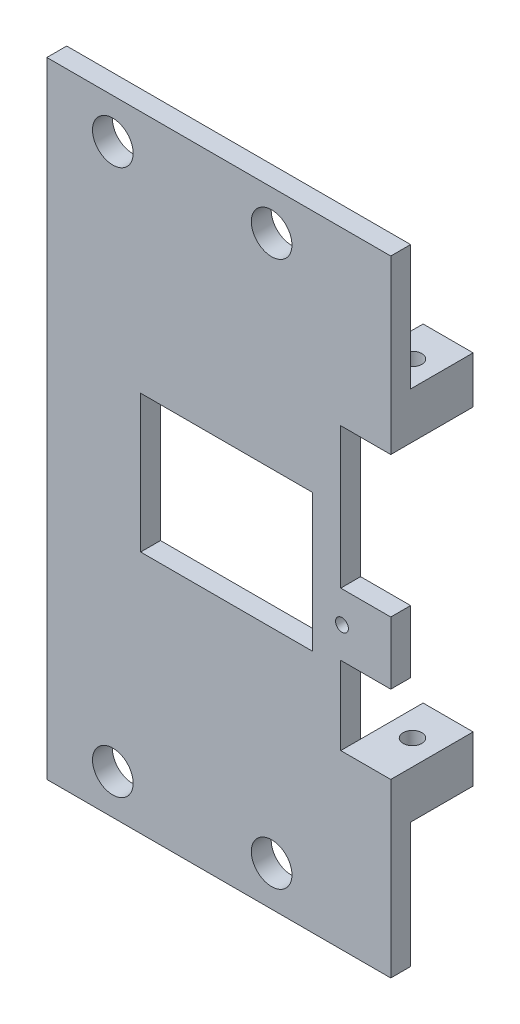
ISO-10303-21;
HEADER;
FILE_DESCRIPTION(('STEP AP214'),'2;1');
FILE_NAME('part.step','',(''),(''),'','','');
FILE_SCHEMA(('AUTOMOTIVE_DESIGN { 1 0 10303 214 1 1 1 1 }'));
ENDSEC;
DATA;
#1=APPLICATION_CONTEXT('core data for automotive mechanical design processes');
#2=APPLICATION_PROTOCOL_DEFINITION('international standard','automotive_design',2000,#1);
#3=PRODUCT_CONTEXT('',#1,'mechanical');
#4=PRODUCT('Part','Part','',(#3));
#5=PRODUCT_RELATED_PRODUCT_CATEGORY('part','',(#4));
#6=PRODUCT_DEFINITION_FORMATION('','',#4);
#7=PRODUCT_DEFINITION_CONTEXT('part definition',#1,'design');
#8=PRODUCT_DEFINITION('design','',#6,#7);
#9=PRODUCT_DEFINITION_SHAPE('','',#8);
#10=(LENGTH_UNIT() NAMED_UNIT(*) SI_UNIT(.MILLI.,.METRE.));
#11=(NAMED_UNIT(*) PLANE_ANGLE_UNIT() SI_UNIT($,.RADIAN.));
#12=(NAMED_UNIT(*) SI_UNIT($,.STERADIAN.) SOLID_ANGLE_UNIT());
#13=UNCERTAINTY_MEASURE_WITH_UNIT(LENGTH_MEASURE(1.E-05),#10,'distance_accuracy_value','');
#14=(GEOMETRIC_REPRESENTATION_CONTEXT(3) GLOBAL_UNCERTAINTY_ASSIGNED_CONTEXT((#13)) GLOBAL_UNIT_ASSIGNED_CONTEXT((#10,
#11,#12)) REPRESENTATION_CONTEXT('',''));
#15=CARTESIAN_POINT('',(0.,0.,0.));
#16=DIRECTION('',(0.,0.,1.));
#17=DIRECTION('',(1.,0.,0.));
#18=AXIS2_PLACEMENT_3D('',#15,#16,#17);
#19=CARTESIAN_POINT('',(54.5,-60.,3.175));
#20=DIRECTION('',(-1.,0.,0.));
#21=DIRECTION('',(0.,0.,1.));
#22=AXIS2_PLACEMENT_3D('',#19,#20,#21);
#23=PLANE('',#22);
#24=DIRECTION('',(0.,0.,1.));
#25=VECTOR('',#24,1.);
#26=CARTESIAN_POINT('',(54.5,-37.5,0.));
#27=LINE('',#26,#25);
#28=CARTESIAN_POINT('',(54.5,-37.5,0.));
#29=VERTEX_POINT('',#28);
#30=CARTESIAN_POINT('',(54.5,-37.5,3.175));
#31=VERTEX_POINT('',#30);
#32=EDGE_CURVE('E56',#29,#31,#27,.T.);
#33=ORIENTED_EDGE('',*,*,#32,.F.);
#34=DIRECTION('',(0.,1.,0.));
#35=VECTOR('',#34,1.);
#36=CARTESIAN_POINT('',(54.5,-60.,0.));
#37=LINE('',#36,#35);
#38=CARTESIAN_POINT('',(54.5,-15.,0.));
#39=VERTEX_POINT('',#38);
#40=EDGE_CURVE('E228',#29,#39,#37,.T.);
#41=ORIENTED_EDGE('',*,*,#40,.T.);
#42=DIRECTION('',(0.,0.,-1.));
#43=VECTOR('',#42,1.);
#44=CARTESIAN_POINT('',(54.5,-15.,3.175));
#45=LINE('',#44,#43);
#46=CARTESIAN_POINT('',(54.5,-15.,3.175));
#47=VERTEX_POINT('',#46);
#48=EDGE_CURVE('E229',#47,#39,#45,.T.);
#49=ORIENTED_EDGE('',*,*,#48,.F.);
#50=DIRECTION('',(0.,1.,0.));
#51=VECTOR('',#50,1.);
#52=CARTESIAN_POINT('',(54.5,-60.,3.175));
#53=LINE('',#52,#51);
#54=EDGE_CURVE('E217',#31,#47,#53,.T.);
#55=ORIENTED_EDGE('',*,*,#54,.F.);
#56=EDGE_LOOP('',(#33,#41,#49,#55));
#57=FACE_BOUND('',#56,.T.);
#58=ADVANCED_FACE('F39',(#57),#23,.F.);
#59=DIRECTION('',(0.,0.,-1.));
#60=VECTOR('',#59,1.);
#61=CARTESIAN_POINT('',(54.5,-47.5,0.));
#62=LINE('',#61,#60);
#63=CARTESIAN_POINT('',(54.5,-47.5,3.175));
#64=VERTEX_POINT('',#63);
#65=CARTESIAN_POINT('',(54.5,-47.5,0.));
#66=VERTEX_POINT('',#65);
#67=EDGE_CURVE('E190',#64,#66,#62,.T.);
#68=ORIENTED_EDGE('',*,*,#67,.F.);
#69=CARTESIAN_POINT('',(54.5,-60.,3.175));
#70=VERTEX_POINT('',#69);
#71=EDGE_CURVE('E203',#70,#64,#53,.T.);
#72=ORIENTED_EDGE('',*,*,#71,.F.);
#73=DIRECTION('',(0.,0.,-1.));
#74=VECTOR('',#73,1.);
#75=CARTESIAN_POINT('',(54.5,-60.,3.175));
#76=LINE('',#75,#74);
#77=CARTESIAN_POINT('',(54.5,-60.,0.));
#78=VERTEX_POINT('',#77);
#79=EDGE_CURVE('E221',#70,#78,#76,.T.);
#80=ORIENTED_EDGE('',*,*,#79,.T.);
#81=EDGE_CURVE('E206',#78,#66,#37,.T.);
#82=ORIENTED_EDGE('',*,*,#81,.T.);
#83=EDGE_LOOP('',(#68,#72,#80,#82));
#84=FACE_BOUND('',#83,.T.);
#85=ADVANCED_FACE('F202',(#84),#23,.F.);
#86=CARTESIAN_POINT('',(62.5,12.5,3.175));
#87=DIRECTION('',(-1.,0.,0.));
#88=DIRECTION('',(0.,-1.,0.));
#89=AXIS2_PLACEMENT_3D('',#86,#87,#88);
#90=PLANE('',#89);
#91=DIRECTION('',(0.,1.,0.));
#92=VECTOR('',#91,1.);
#93=CARTESIAN_POINT('',(62.5,12.5,3.175));
#94=LINE('',#93,#92);
#95=CARTESIAN_POINT('',(62.5,-15.,3.175));
#96=VERTEX_POINT('',#95);
#97=CARTESIAN_POINT('',(62.5,12.5,3.175));
#98=VERTEX_POINT('',#97);
#99=EDGE_CURVE('E395',#96,#98,#94,.T.);
#100=ORIENTED_EDGE('',*,*,#99,.F.);
#101=DIRECTION('',(0.,0.,-1.));
#102=VECTOR('',#101,1.);
#103=CARTESIAN_POINT('',(62.5,-15.,0.));
#104=LINE('',#103,#102);
#105=CARTESIAN_POINT('',(62.5,-15.,-10.));
#106=VERTEX_POINT('',#105);
#107=EDGE_CURVE('E285',#96,#106,#104,.T.);
#108=ORIENTED_EDGE('',*,*,#107,.T.);
#109=DIRECTION('',(0.,-1.,0.));
#110=VECTOR('',#109,1.);
#111=CARTESIAN_POINT('',(62.5,-7.50000000000001,-10.));
#112=LINE('',#111,#110);
#113=CARTESIAN_POINT('',(62.5,-7.50000000000001,-10.));
#114=VERTEX_POINT('',#113);
#115=EDGE_CURVE('E299',#114,#106,#112,.T.);
#116=ORIENTED_EDGE('',*,*,#115,.F.);
#117=DIRECTION('',(0.,0.,1.));
#118=VECTOR('',#117,1.);
#119=CARTESIAN_POINT('',(62.5,-7.50000000000001,-10.));
#120=LINE('',#119,#118);
#121=CARTESIAN_POINT('',(62.5,-7.5,0.));
#122=VERTEX_POINT('',#121);
#123=EDGE_CURVE('E315',#114,#122,#120,.T.);
#124=ORIENTED_EDGE('',*,*,#123,.T.);
#125=DIRECTION('',(0.,1.,0.));
#126=VECTOR('',#125,1.);
#127=CARTESIAN_POINT('',(62.5,12.5,0.));
#128=LINE('',#127,#126);
#129=CARTESIAN_POINT('',(62.5,12.5,0.));
#130=VERTEX_POINT('',#129);
#131=EDGE_CURVE('E409',#122,#130,#128,.T.);
#132=ORIENTED_EDGE('',*,*,#131,.T.);
#133=DIRECTION('',(0.,0.,-1.));
#134=VECTOR('',#133,1.);
#135=CARTESIAN_POINT('',(62.5,12.5,3.175));
#136=LINE('',#135,#134);
#137=EDGE_CURVE('E419',#98,#130,#136,.T.);
#138=ORIENTED_EDGE('',*,*,#137,.F.);
#139=EDGE_LOOP('',(#100,#108,#116,#124,#132,#138));
#140=FACE_BOUND('',#139,.T.);
#141=ADVANCED_FACE('F481',(#140),#90,.F.);
#142=CARTESIAN_POINT('',(54.5,-7.5,-10.));
#143=DIRECTION('',(1.,0.,0.));
#144=DIRECTION('',(0.,1.,0.));
#145=AXIS2_PLACEMENT_3D('',#142,#143,#144);
#146=PLANE('',#145);
#147=DIRECTION('',(0.,1.,0.));
#148=VECTOR('',#147,1.);
#149=CARTESIAN_POINT('',(54.5,-7.5,-10.));
#150=LINE('',#149,#148);
#151=CARTESIAN_POINT('',(54.5,-15.,-10.));
#152=VERTEX_POINT('',#151);
#153=CARTESIAN_POINT('',(54.5,-7.5,-10.));
#154=VERTEX_POINT('',#153);
#155=EDGE_CURVE('E307',#152,#154,#150,.T.);
#156=ORIENTED_EDGE('',*,*,#155,.F.);
#157=DIRECTION('',(0.,0.,-1.));
#158=VECTOR('',#157,1.);
#159=CARTESIAN_POINT('',(54.5,-15.,0.));
#160=LINE('',#159,#158);
#161=EDGE_CURVE('E290',#39,#152,#160,.T.);
#162=ORIENTED_EDGE('',*,*,#161,.F.);
#163=DIRECTION('',(0.,1.,0.));
#164=VECTOR('',#163,1.);
#165=CARTESIAN_POINT('',(54.5,-7.5,0.));
#166=LINE('',#165,#164);
#167=CARTESIAN_POINT('',(54.5,-7.5,0.));
#168=VERTEX_POINT('',#167);
#169=EDGE_CURVE('E319',#39,#168,#166,.T.);
#170=ORIENTED_EDGE('',*,*,#169,.T.);
#171=DIRECTION('',(0.,0.,1.));
#172=VECTOR('',#171,1.);
#173=CARTESIAN_POINT('',(54.5,-7.5,-10.));
#174=LINE('',#173,#172);
#175=EDGE_CURVE('E331',#154,#168,#174,.T.);
#176=ORIENTED_EDGE('',*,*,#175,.F.);
#177=EDGE_LOOP('',(#156,#162,#170,#176));
#178=FACE_BOUND('',#177,.T.);
#179=ADVANCED_FACE('F471',(#178),#146,.F.);
#180=CARTESIAN_POINT('',(0.,0.,-10.));
#181=DIRECTION('',(0.,0.,-1.));
#182=DIRECTION('',(-1.,0.,0.));
#183=AXIS2_PLACEMENT_3D('',#180,#181,#182);
#184=PLANE('',#183);
#185=DIRECTION('',(1.,0.,0.));
#186=VECTOR('',#185,1.);
#187=CARTESIAN_POINT('',(62.5,-15.,-10.));
#188=LINE('',#187,#186);
#189=EDGE_CURVE('E282',#152,#106,#188,.T.);
#190=ORIENTED_EDGE('',*,*,#189,.F.);
#191=ORIENTED_EDGE('',*,*,#155,.T.);
#192=DIRECTION('',(1.,0.,0.));
#193=VECTOR('',#192,1.);
#194=CARTESIAN_POINT('',(62.5,-7.50000000000001,-10.));
#195=LINE('',#194,#193);
#196=EDGE_CURVE('E312',#154,#114,#195,.T.);
#197=ORIENTED_EDGE('',*,*,#196,.T.);
#198=ORIENTED_EDGE('',*,*,#115,.T.);
#199=EDGE_LOOP('',(#190,#191,#197,#198));
#200=FACE_BOUND('',#199,.T.);
#201=ADVANCED_FACE('F510',(#200),#184,.T.);
#202=CARTESIAN_POINT('',(0.,0.,0.));
#203=DIRECTION('',(0.,0.,1.));
#204=DIRECTION('',(1.,0.,0.));
#205=AXIS2_PLACEMENT_3D('',#202,#203,#204);
#206=PLANE('',#205);
#207=CARTESIAN_POINT('',(54.7,-42.5,0.));
#208=DIRECTION('',(0.,0.,-1.));
#209=DIRECTION('',(-1.,0.,0.));
#210=AXIS2_PLACEMENT_3D('',#207,#208,#209);
#211=CIRCLE('',#210,1.025);
#212=CARTESIAN_POINT('',(53.675,-42.5,0.));
#213=VERTEX_POINT('',#212);
#214=EDGE_CURVE('E557',#213,#213,#211,.T.);
#215=ORIENTED_EDGE('',*,*,#214,.F.);
#216=EDGE_LOOP('',(#215));
#217=FACE_BOUND('',#216,.T.);
#218=CARTESIAN_POINT('',(43.45,6.125,0.));
#219=DIRECTION('',(0.,0.,-1.));
#220=DIRECTION('',(-1.,0.,0.));
#221=AXIS2_PLACEMENT_3D('',#218,#219,#220);
#222=CIRCLE('',#221,3.25);
#223=CARTESIAN_POINT('',(40.2,6.125,0.));
#224=VERTEX_POINT('',#223);
#225=EDGE_CURVE('E233',#224,#224,#222,.T.);
#226=ORIENTED_EDGE('',*,*,#225,.F.);
#227=EDGE_LOOP('',(#226));
#228=FACE_BOUND('',#227,.T.);
#229=CARTESIAN_POINT('',(18.05,6.125,0.));
#230=DIRECTION('',(0.,0.,-1.));
#231=DIRECTION('',(-1.,0.,0.));
#232=AXIS2_PLACEMENT_3D('',#229,#230,#231);
#233=CIRCLE('',#232,3.25);
#234=CARTESIAN_POINT('',(14.8,6.125,0.));
#235=VERTEX_POINT('',#234);
#236=EDGE_CURVE('E249',#235,#235,#233,.T.);
#237=ORIENTED_EDGE('',*,*,#236,.F.);
#238=EDGE_LOOP('',(#237));
#239=FACE_BOUND('',#238,.T.);
#240=CARTESIAN_POINT('',(18.05,-81.125,0.));
#241=DIRECTION('',(0.,0.,-1.));
#242=DIRECTION('',(-1.,0.,0.));
#243=AXIS2_PLACEMENT_3D('',#240,#241,#242);
#244=CIRCLE('',#243,3.25);
#245=CARTESIAN_POINT('',(14.8,-81.125,0.));
#246=VERTEX_POINT('',#245);
#247=EDGE_CURVE('E241',#246,#246,#244,.T.);
#248=ORIENTED_EDGE('',*,*,#247,.F.);
#249=EDGE_LOOP('',(#248));
#250=FACE_BOUND('',#249,.T.);
#251=CARTESIAN_POINT('',(43.45,-81.125,0.));
#252=DIRECTION('',(0.,0.,-1.));
#253=DIRECTION('',(-1.,0.,0.));
#254=AXIS2_PLACEMENT_3D('',#251,#252,#253);
#255=CIRCLE('',#254,3.25);
#256=CARTESIAN_POINT('',(40.2,-81.125,0.));
#257=VERTEX_POINT('',#256);
#258=EDGE_CURVE('E240',#257,#257,#255,.T.);
#259=ORIENTED_EDGE('',*,*,#258,.F.);
#260=EDGE_LOOP('',(#259));
#261=FACE_BOUND('',#260,.T.);
#262=DIRECTION('',(0.,1.,0.));
#263=VECTOR('',#262,1.);
#264=CARTESIAN_POINT('',(50.,-26.5,0.));
#265=LINE('',#264,#263);
#266=CARTESIAN_POINT('',(50.,-48.5,0.));
#267=VERTEX_POINT('',#266);
#268=CARTESIAN_POINT('',(50.,-26.5,0.));
#269=VERTEX_POINT('',#268);
#270=EDGE_CURVE('E343',#267,#269,#265,.T.);
#271=ORIENTED_EDGE('',*,*,#270,.T.);
#272=DIRECTION('',(-1.,0.,0.));
#273=VECTOR('',#272,1.);
#274=CARTESIAN_POINT('',(22.5,-26.5,0.));
#275=LINE('',#274,#273);
#276=CARTESIAN_POINT('',(22.5,-26.5,0.));
#277=VERTEX_POINT('',#276);
#278=EDGE_CURVE('E362',#269,#277,#275,.T.);
#279=ORIENTED_EDGE('',*,*,#278,.T.);
#280=DIRECTION('',(0.,-1.,0.));
#281=VECTOR('',#280,1.);
#282=CARTESIAN_POINT('',(22.5,-26.5,0.));
#283=LINE('',#282,#281);
#284=CARTESIAN_POINT('',(22.5,-48.5,0.));
#285=VERTEX_POINT('',#284);
#286=EDGE_CURVE('E366',#277,#285,#283,.T.);
#287=ORIENTED_EDGE('',*,*,#286,.T.);
#288=DIRECTION('',(1.,0.,0.));
#289=VECTOR('',#288,1.);
#290=CARTESIAN_POINT('',(22.5,-48.5,0.));
#291=LINE('',#290,#289);
#292=EDGE_CURVE('E348',#285,#267,#291,.T.);
#293=ORIENTED_EDGE('',*,*,#292,.T.);
#294=EDGE_LOOP('',(#271,#279,#287,#293));
#295=FACE_BOUND('',#294,.T.);
#296=ORIENTED_EDGE('',*,*,#169,.F.);
#297=ORIENTED_EDGE('',*,*,#40,.F.);
#298=DIRECTION('',(-1.,0.,0.));
#299=VECTOR('',#298,1.);
#300=CARTESIAN_POINT('',(72.9919314237179,-37.5,0.));
#301=LINE('',#300,#299);
#302=CARTESIAN_POINT('',(62.5,-37.5,0.));
#303=VERTEX_POINT('',#302);
#304=EDGE_CURVE('E534',#303,#29,#301,.T.);
#305=ORIENTED_EDGE('',*,*,#304,.F.);
#306=DIRECTION('',(0.,-1.,0.));
#307=VECTOR('',#306,1.);
#308=CARTESIAN_POINT('',(62.5,-37.5,0.));
#309=LINE('',#308,#307);
#310=CARTESIAN_POINT('',(62.5,-47.5,0.));
#311=VERTEX_POINT('',#310);
#312=EDGE_CURVE('E542',#303,#311,#309,.T.);
#313=ORIENTED_EDGE('',*,*,#312,.T.);
#314=DIRECTION('',(-1.,0.,0.));
#315=VECTOR('',#314,1.);
#316=CARTESIAN_POINT('',(72.9919314237179,-47.5,0.));
#317=LINE('',#316,#315);
#318=EDGE_CURVE('E198',#311,#66,#317,.T.);
#319=ORIENTED_EDGE('',*,*,#318,.T.);
#320=ORIENTED_EDGE('',*,*,#81,.F.);
#321=CARTESIAN_POINT('',(54.5,-67.5,0.));
#322=VERTEX_POINT('',#321);
#323=EDGE_CURVE('E320',#322,#78,#166,.T.);
#324=ORIENTED_EDGE('',*,*,#323,.F.);
#325=DIRECTION('',(-1.,0.,0.));
#326=VECTOR('',#325,1.);
#327=CARTESIAN_POINT('',(62.5,-67.5,0.));
#328=LINE('',#327,#326);
#329=CARTESIAN_POINT('',(62.5,-67.5,0.));
#330=VERTEX_POINT('',#329);
#331=EDGE_CURVE('E289',#330,#322,#328,.T.);
#332=ORIENTED_EDGE('',*,*,#331,.F.);
#333=CARTESIAN_POINT('',(62.5,-87.5,0.));
#334=VERTEX_POINT('',#333);
#335=EDGE_CURVE('E410',#334,#330,#128,.T.);
#336=ORIENTED_EDGE('',*,*,#335,.F.);
#337=DIRECTION('',(1.,0.,0.));
#338=VECTOR('',#337,1.);
#339=CARTESIAN_POINT('',(7.50000000000001,-87.5,0.));
#340=LINE('',#339,#338);
#341=CARTESIAN_POINT('',(7.50000000000001,-87.5,0.));
#342=VERTEX_POINT('',#341);
#343=EDGE_CURVE('E406',#342,#334,#340,.T.);
#344=ORIENTED_EDGE('',*,*,#343,.F.);
#345=DIRECTION('',(0.,-1.,0.));
#346=VECTOR('',#345,1.);
#347=CARTESIAN_POINT('',(7.49999999999999,12.5,0.));
#348=LINE('',#347,#346);
#349=CARTESIAN_POINT('',(7.49999999999999,12.5,0.));
#350=VERTEX_POINT('',#349);
#351=EDGE_CURVE('E386',#350,#342,#348,.T.);
#352=ORIENTED_EDGE('',*,*,#351,.F.);
#353=DIRECTION('',(-1.,0.,0.));
#354=VECTOR('',#353,1.);
#355=CARTESIAN_POINT('',(7.49999999999999,12.5,0.));
#356=LINE('',#355,#354);
#357=EDGE_CURVE('E392',#130,#350,#356,.T.);
#358=ORIENTED_EDGE('',*,*,#357,.F.);
#359=ORIENTED_EDGE('',*,*,#131,.F.);
#360=DIRECTION('',(1.,0.,0.));
#361=VECTOR('',#360,1.);
#362=CARTESIAN_POINT('',(62.5,-7.50000000000001,0.));
#363=LINE('',#362,#361);
#364=EDGE_CURVE('E324',#168,#122,#363,.T.);
#365=ORIENTED_EDGE('',*,*,#364,.F.);
#366=EDGE_LOOP('',(#296,#297,#305,#313,#319,#320,#324,#332,#336,#344,#352,#358,#359,#365));
#367=FACE_BOUND('',#366,.T.);
#368=ADVANCED_FACE('F434',(#217,#228,#239,#250,#261,#295,#367),#206,.F.);
#369=CARTESIAN_POINT('',(0.,0.,3.175));
#370=DIRECTION('',(0.,0.,1.));
#371=DIRECTION('',(1.,0.,0.));
#372=AXIS2_PLACEMENT_3D('',#369,#370,#371);
#373=PLANE('',#372);
#374=CARTESIAN_POINT('',(54.7,-42.5,3.175));
#375=DIRECTION('',(0.,0.,-1.));
#376=DIRECTION('',(-1.,0.,0.));
#377=AXIS2_PLACEMENT_3D('',#374,#375,#376);
#378=CIRCLE('',#377,1.025);
#379=CARTESIAN_POINT('',(53.675,-42.5,3.175));
#380=VERTEX_POINT('',#379);
#381=EDGE_CURVE('E208',#380,#380,#378,.T.);
#382=ORIENTED_EDGE('',*,*,#381,.T.);
#383=EDGE_LOOP('',(#382));
#384=FACE_BOUND('',#383,.T.);
#385=DIRECTION('',(1.,0.,0.));
#386=VECTOR('',#385,1.);
#387=CARTESIAN_POINT('',(62.5,-15.,3.175));
#388=LINE('',#387,#386);
#389=EDGE_CURVE('E216',#47,#96,#388,.T.);
#390=ORIENTED_EDGE('',*,*,#389,.T.);
#391=ORIENTED_EDGE('',*,*,#99,.T.);
#392=DIRECTION('',(-1.,0.,0.));
#393=VECTOR('',#392,1.);
#394=CARTESIAN_POINT('',(7.49999999999999,12.5,3.175));
#395=LINE('',#394,#393);
#396=CARTESIAN_POINT('',(7.49999999999999,12.5,3.175));
#397=VERTEX_POINT('',#396);
#398=EDGE_CURVE('E399',#98,#397,#395,.T.);
#399=ORIENTED_EDGE('',*,*,#398,.T.);
#400=DIRECTION('',(0.,-1.,0.));
#401=VECTOR('',#400,1.);
#402=CARTESIAN_POINT('',(7.49999999999999,12.5,3.175));
#403=LINE('',#402,#401);
#404=CARTESIAN_POINT('',(7.50000000000001,-87.5,3.175));
#405=VERTEX_POINT('',#404);
#406=EDGE_CURVE('E387',#397,#405,#403,.T.);
#407=ORIENTED_EDGE('',*,*,#406,.T.);
#408=DIRECTION('',(1.,0.,0.));
#409=VECTOR('',#408,1.);
#410=CARTESIAN_POINT('',(7.50000000000001,-87.5,3.175));
#411=LINE('',#410,#409);
#412=CARTESIAN_POINT('',(62.5,-87.5,3.175));
#413=VERTEX_POINT('',#412);
#414=EDGE_CURVE('E391',#405,#413,#411,.T.);
#415=ORIENTED_EDGE('',*,*,#414,.T.);
#416=CARTESIAN_POINT('',(62.5,-60.,3.175));
#417=VERTEX_POINT('',#416);
#418=EDGE_CURVE('E396',#413,#417,#94,.T.);
#419=ORIENTED_EDGE('',*,*,#418,.T.);
#420=DIRECTION('',(-1.,0.,0.));
#421=VECTOR('',#420,1.);
#422=CARTESIAN_POINT('',(62.5,-60.,3.175));
#423=LINE('',#422,#421);
#424=EDGE_CURVE('E214',#417,#70,#423,.T.);
#425=ORIENTED_EDGE('',*,*,#424,.T.);
#426=ORIENTED_EDGE('',*,*,#71,.T.);
#427=DIRECTION('',(-1.,0.,0.));
#428=VECTOR('',#427,1.);
#429=CARTESIAN_POINT('',(72.9919314237179,-47.5,3.175));
#430=LINE('',#429,#428);
#431=CARTESIAN_POINT('',(62.5,-47.5,3.175));
#432=VERTEX_POINT('',#431);
#433=EDGE_CURVE('E186',#432,#64,#430,.T.);
#434=ORIENTED_EDGE('',*,*,#433,.F.);
#435=DIRECTION('',(0.,1.,0.));
#436=VECTOR('',#435,1.);
#437=CARTESIAN_POINT('',(62.5,-37.5,3.175));
#438=LINE('',#437,#436);
#439=CARTESIAN_POINT('',(62.5,-37.5,3.175));
#440=VERTEX_POINT('',#439);
#441=EDGE_CURVE('E538',#432,#440,#438,.T.);
#442=ORIENTED_EDGE('',*,*,#441,.T.);
#443=DIRECTION('',(-1.,0.,0.));
#444=VECTOR('',#443,1.);
#445=CARTESIAN_POINT('',(72.9919314237179,-37.5,3.175));
#446=LINE('',#445,#444);
#447=EDGE_CURVE('E548',#440,#31,#446,.T.);
#448=ORIENTED_EDGE('',*,*,#447,.T.);
#449=ORIENTED_EDGE('',*,*,#54,.T.);
#450=EDGE_LOOP('',(#390,#391,#399,#407,#415,#419,#425,#426,#434,#442,#448,#449));
#451=FACE_BOUND('',#450,.T.);
#452=CARTESIAN_POINT('',(43.45,6.125,3.175));
#453=DIRECTION('',(0.,0.,-1.));
#454=DIRECTION('',(-1.,0.,0.));
#455=AXIS2_PLACEMENT_3D('',#452,#453,#454);
#456=CIRCLE('',#455,3.25);
#457=CARTESIAN_POINT('',(40.2,6.125,3.175));
#458=VERTEX_POINT('',#457);
#459=EDGE_CURVE('E253',#458,#458,#456,.T.);
#460=ORIENTED_EDGE('',*,*,#459,.T.);
#461=EDGE_LOOP('',(#460));
#462=FACE_BOUND('',#461,.T.);
#463=CARTESIAN_POINT('',(18.05,6.125,3.175));
#464=DIRECTION('',(0.,0.,-1.));
#465=DIRECTION('',(-1.,0.,0.));
#466=AXIS2_PLACEMENT_3D('',#463,#464,#465);
#467=CIRCLE('',#466,3.25);
#468=CARTESIAN_POINT('',(14.8,6.125,3.175));
#469=VERTEX_POINT('',#468);
#470=EDGE_CURVE('E245',#469,#469,#467,.T.);
#471=ORIENTED_EDGE('',*,*,#470,.T.);
#472=EDGE_LOOP('',(#471));
#473=FACE_BOUND('',#472,.T.);
#474=CARTESIAN_POINT('',(18.05,-81.125,3.175));
#475=DIRECTION('',(0.,0.,-1.));
#476=DIRECTION('',(-1.,0.,0.));
#477=AXIS2_PLACEMENT_3D('',#474,#475,#476);
#478=CIRCLE('',#477,3.25);
#479=CARTESIAN_POINT('',(14.8,-81.125,3.175));
#480=VERTEX_POINT('',#479);
#481=EDGE_CURVE('E236',#480,#480,#478,.T.);
#482=ORIENTED_EDGE('',*,*,#481,.T.);
#483=EDGE_LOOP('',(#482));
#484=FACE_BOUND('',#483,.T.);
#485=CARTESIAN_POINT('',(43.45,-81.125,3.175));
#486=DIRECTION('',(0.,0.,-1.));
#487=DIRECTION('',(-1.,0.,0.));
#488=AXIS2_PLACEMENT_3D('',#485,#486,#487);
#489=CIRCLE('',#488,3.25);
#490=CARTESIAN_POINT('',(40.2,-81.125,3.175));
#491=VERTEX_POINT('',#490);
#492=EDGE_CURVE('E260',#491,#491,#489,.T.);
#493=ORIENTED_EDGE('',*,*,#492,.T.);
#494=EDGE_LOOP('',(#493));
#495=FACE_BOUND('',#494,.T.);
#496=DIRECTION('',(-1.,0.,0.));
#497=VECTOR('',#496,1.);
#498=CARTESIAN_POINT('',(22.5,-26.5,3.175));
#499=LINE('',#498,#497);
#500=CARTESIAN_POINT('',(50.,-26.5,3.175));
#501=VERTEX_POINT('',#500);
#502=CARTESIAN_POINT('',(22.5,-26.5,3.175));
#503=VERTEX_POINT('',#502);
#504=EDGE_CURVE('E347',#501,#503,#499,.T.);
#505=ORIENTED_EDGE('',*,*,#504,.F.);
#506=DIRECTION('',(0.,1.,0.));
#507=VECTOR('',#506,1.);
#508=CARTESIAN_POINT('',(50.,-26.5,3.175));
#509=LINE('',#508,#507);
#510=CARTESIAN_POINT('',(50.,-48.5,3.175));
#511=VERTEX_POINT('',#510);
#512=EDGE_CURVE('E344',#511,#501,#509,.T.);
#513=ORIENTED_EDGE('',*,*,#512,.F.);
#514=DIRECTION('',(1.,0.,0.));
#515=VECTOR('',#514,1.);
#516=CARTESIAN_POINT('',(22.5,-48.5,3.175));
#517=LINE('',#516,#515);
#518=CARTESIAN_POINT('',(22.5,-48.5,3.175));
#519=VERTEX_POINT('',#518);
#520=EDGE_CURVE('E355',#519,#511,#517,.T.);
#521=ORIENTED_EDGE('',*,*,#520,.F.);
#522=DIRECTION('',(0.,-1.,0.));
#523=VECTOR('',#522,1.);
#524=CARTESIAN_POINT('',(22.5,-26.5,3.175));
#525=LINE('',#524,#523);
#526=EDGE_CURVE('E351',#503,#519,#525,.T.);
#527=ORIENTED_EDGE('',*,*,#526,.F.);
#528=EDGE_LOOP('',(#505,#513,#521,#527));
#529=FACE_BOUND('',#528,.T.);
#530=ADVANCED_FACE('F211',(#384,#451,#462,#473,#484,#495,#529),#373,.T.);
#531=CARTESIAN_POINT('',(7.49999999999999,12.5,3.175));
#532=DIRECTION('',(1.,0.,0.));
#533=DIRECTION('',(0.,1.,0.));
#534=AXIS2_PLACEMENT_3D('',#531,#532,#533);
#535=PLANE('',#534);
#536=ORIENTED_EDGE('',*,*,#351,.T.);
#537=DIRECTION('',(0.,0.,-1.));
#538=VECTOR('',#537,1.);
#539=CARTESIAN_POINT('',(7.50000000000001,-87.5,3.175));
#540=LINE('',#539,#538);
#541=EDGE_CURVE('E11',#405,#342,#540,.T.);
#542=ORIENTED_EDGE('',*,*,#541,.F.);
#543=ORIENTED_EDGE('',*,*,#406,.F.);
#544=DIRECTION('',(0.,0.,-1.));
#545=VECTOR('',#544,1.);
#546=CARTESIAN_POINT('',(7.49999999999999,12.5,3.175));
#547=LINE('',#546,#545);
#548=EDGE_CURVE('E402',#397,#350,#547,.T.);
#549=ORIENTED_EDGE('',*,*,#548,.T.);
#550=EDGE_LOOP('',(#536,#542,#543,#549));
#551=FACE_BOUND('',#550,.T.);
#552=ADVANCED_FACE('F41',(#551),#535,.F.);
#553=CARTESIAN_POINT('',(7.50000000000001,-87.5,3.175));
#554=DIRECTION('',(0.,1.,0.));
#555=DIRECTION('',(0.,0.,1.));
#556=AXIS2_PLACEMENT_3D('',#553,#554,#555);
#557=PLANE('',#556);
#558=ORIENTED_EDGE('',*,*,#343,.T.);
#559=DIRECTION('',(0.,0.,-1.));
#560=VECTOR('',#559,1.);
#561=CARTESIAN_POINT('',(62.5,-87.5,3.175));
#562=LINE('',#561,#560);
#563=EDGE_CURVE('E49',#413,#334,#562,.T.);
#564=ORIENTED_EDGE('',*,*,#563,.F.);
#565=ORIENTED_EDGE('',*,*,#414,.F.);
#566=ORIENTED_EDGE('',*,*,#541,.T.);
#567=EDGE_LOOP('',(#558,#564,#565,#566));
#568=FACE_BOUND('',#567,.T.);
#569=ADVANCED_FACE('F615',(#568),#557,.F.);
#570=DIRECTION('',(0.,0.,-1.));
#571=VECTOR('',#570,1.);
#572=CARTESIAN_POINT('',(62.5,-60.,0.));
#573=LINE('',#572,#571);
#574=CARTESIAN_POINT('',(62.5,-60.,-10.));
#575=VERTEX_POINT('',#574);
#576=EDGE_CURVE('E64',#417,#575,#573,.T.);
#577=ORIENTED_EDGE('',*,*,#576,.F.);
#578=ORIENTED_EDGE('',*,*,#418,.F.);
#579=ORIENTED_EDGE('',*,*,#563,.T.);
#580=ORIENTED_EDGE('',*,*,#335,.T.);
#581=DIRECTION('',(0.,0.,1.));
#582=VECTOR('',#581,1.);
#583=CARTESIAN_POINT('',(62.5,-67.5,-10.));
#584=LINE('',#583,#582);
#585=CARTESIAN_POINT('',(62.5,-67.5,-10.));
#586=VERTEX_POINT('',#585);
#587=EDGE_CURVE('E339',#586,#330,#584,.T.);
#588=ORIENTED_EDGE('',*,*,#587,.F.);
#589=EDGE_CURVE('E304',#575,#586,#112,.T.);
#590=ORIENTED_EDGE('',*,*,#589,.F.);
#591=EDGE_LOOP('',(#577,#578,#579,#580,#588,#590));
#592=FACE_BOUND('',#591,.T.);
#593=ADVANCED_FACE('F429',(#592),#90,.F.);
#594=CARTESIAN_POINT('',(7.49999999999999,12.5,3.175));
#595=DIRECTION('',(0.,-1.,0.));
#596=DIRECTION('',(0.,0.,-1.));
#597=AXIS2_PLACEMENT_3D('',#594,#595,#596);
#598=PLANE('',#597);
#599=ORIENTED_EDGE('',*,*,#357,.T.);
#600=ORIENTED_EDGE('',*,*,#548,.F.);
#601=ORIENTED_EDGE('',*,*,#398,.F.);
#602=ORIENTED_EDGE('',*,*,#137,.T.);
#603=EDGE_LOOP('',(#599,#600,#601,#602));
#604=FACE_BOUND('',#603,.T.);
#605=ADVANCED_FACE('F608',(#604),#598,.F.);
#606=CARTESIAN_POINT('',(50.,-26.5,3.175));
#607=DIRECTION('',(-1.,0.,0.));
#608=DIRECTION('',(0.,0.,1.));
#609=AXIS2_PLACEMENT_3D('',#606,#607,#608);
#610=PLANE('',#609);
#611=ORIENTED_EDGE('',*,*,#270,.F.);
#612=DIRECTION('',(0.,0.,-1.));
#613=VECTOR('',#612,1.);
#614=CARTESIAN_POINT('',(50.,-48.5,3.175));
#615=LINE('',#614,#613);
#616=EDGE_CURVE('E358',#511,#267,#615,.T.);
#617=ORIENTED_EDGE('',*,*,#616,.F.);
#618=ORIENTED_EDGE('',*,*,#512,.T.);
#619=DIRECTION('',(0.,0.,-1.));
#620=VECTOR('',#619,1.);
#621=CARTESIAN_POINT('',(50.,-26.5,3.175));
#622=LINE('',#621,#620);
#623=EDGE_CURVE('E382',#501,#269,#622,.T.);
#624=ORIENTED_EDGE('',*,*,#623,.T.);
#625=EDGE_LOOP('',(#611,#617,#618,#624));
#626=FACE_BOUND('',#625,.T.);
#627=ADVANCED_FACE('F587',(#626),#610,.T.);
#628=CARTESIAN_POINT('',(22.5,-26.5,3.175));
#629=DIRECTION('',(0.,-1.,0.));
#630=DIRECTION('',(0.,0.,-1.));
#631=AXIS2_PLACEMENT_3D('',#628,#629,#630);
#632=PLANE('',#631);
#633=ORIENTED_EDGE('',*,*,#278,.F.);
#634=ORIENTED_EDGE('',*,*,#623,.F.);
#635=ORIENTED_EDGE('',*,*,#504,.T.);
#636=DIRECTION('',(0.,0.,-1.));
#637=VECTOR('',#636,1.);
#638=CARTESIAN_POINT('',(22.5,-26.5,3.175));
#639=LINE('',#638,#637);
#640=EDGE_CURVE('E379',#503,#277,#639,.T.);
#641=ORIENTED_EDGE('',*,*,#640,.T.);
#642=EDGE_LOOP('',(#633,#634,#635,#641));
#643=FACE_BOUND('',#642,.T.);
#644=ADVANCED_FACE('F595',(#643),#632,.T.);
#645=CARTESIAN_POINT('',(22.5,-26.5,3.175));
#646=DIRECTION('',(1.,0.,0.));
#647=DIRECTION('',(0.,1.,0.));
#648=AXIS2_PLACEMENT_3D('',#645,#646,#647);
#649=PLANE('',#648);
#650=ORIENTED_EDGE('',*,*,#286,.F.);
#651=ORIENTED_EDGE('',*,*,#640,.F.);
#652=ORIENTED_EDGE('',*,*,#526,.T.);
#653=DIRECTION('',(0.,0.,-1.));
#654=VECTOR('',#653,1.);
#655=CARTESIAN_POINT('',(22.5,-48.5,3.175));
#656=LINE('',#655,#654);
#657=EDGE_CURVE('E376',#519,#285,#656,.T.);
#658=ORIENTED_EDGE('',*,*,#657,.T.);
#659=EDGE_LOOP('',(#650,#651,#652,#658));
#660=FACE_BOUND('',#659,.T.);
#661=ADVANCED_FACE('F472',(#660),#649,.T.);
#662=CARTESIAN_POINT('',(22.5,-48.5,3.175));
#663=DIRECTION('',(0.,1.,0.));
#664=DIRECTION('',(0.,0.,1.));
#665=AXIS2_PLACEMENT_3D('',#662,#663,#664);
#666=PLANE('',#665);
#667=ORIENTED_EDGE('',*,*,#292,.F.);
#668=ORIENTED_EDGE('',*,*,#657,.F.);
#669=ORIENTED_EDGE('',*,*,#520,.T.);
#670=ORIENTED_EDGE('',*,*,#616,.T.);
#671=EDGE_LOOP('',(#667,#668,#669,#670));
#672=FACE_BOUND('',#671,.T.);
#673=ADVANCED_FACE('F463',(#672),#666,.T.);
#674=CARTESIAN_POINT('',(62.5,-67.5,-10.));
#675=DIRECTION('',(0.,1.,0.));
#676=DIRECTION('',(0.,0.,1.));
#677=AXIS2_PLACEMENT_3D('',#674,#675,#676);
#678=PLANE('',#677);
#679=CARTESIAN_POINT('',(58.5,-67.5,-4.3));
#680=DIRECTION('',(0.,1.,0.));
#681=DIRECTION('',(0.,0.,1.));
#682=AXIS2_PLACEMENT_3D('',#679,#680,#681);
#683=CIRCLE('',#682,1.5);
#684=CARTESIAN_POINT('',(58.5,-67.5,-2.8));
#685=VERTEX_POINT('',#684);
#686=EDGE_CURVE('E275',#685,#685,#683,.T.);
#687=ORIENTED_EDGE('',*,*,#686,.T.);
#688=EDGE_LOOP('',(#687));
#689=FACE_BOUND('',#688,.T.);
#690=ORIENTED_EDGE('',*,*,#331,.T.);
#691=DIRECTION('',(0.,0.,1.));
#692=VECTOR('',#691,1.);
#693=CARTESIAN_POINT('',(54.5,-67.5,-10.));
#694=LINE('',#693,#692);
#695=CARTESIAN_POINT('',(54.5,-67.5,-10.));
#696=VERTEX_POINT('',#695);
#697=EDGE_CURVE('E335',#696,#322,#694,.T.);
#698=ORIENTED_EDGE('',*,*,#697,.F.);
#699=DIRECTION('',(-1.,0.,0.));
#700=VECTOR('',#699,1.);
#701=CARTESIAN_POINT('',(62.5,-67.5,-10.));
#702=LINE('',#701,#700);
#703=EDGE_CURVE('E303',#586,#696,#702,.T.);
#704=ORIENTED_EDGE('',*,*,#703,.F.);
#705=ORIENTED_EDGE('',*,*,#587,.T.);
#706=EDGE_LOOP('',(#690,#698,#704,#705));
#707=FACE_BOUND('',#706,.T.);
#708=ADVANCED_FACE('F438',(#689,#707),#678,.F.);
#709=ORIENTED_EDGE('',*,*,#323,.T.);
#710=DIRECTION('',(0.,0.,-1.));
#711=VECTOR('',#710,1.);
#712=CARTESIAN_POINT('',(54.5,-60.,0.));
#713=LINE('',#712,#711);
#714=CARTESIAN_POINT('',(54.5,-60.,-10.));
#715=VERTEX_POINT('',#714);
#716=EDGE_CURVE('E293',#78,#715,#713,.T.);
#717=ORIENTED_EDGE('',*,*,#716,.T.);
#718=EDGE_CURVE('E308',#696,#715,#150,.T.);
#719=ORIENTED_EDGE('',*,*,#718,.F.);
#720=ORIENTED_EDGE('',*,*,#697,.T.);
#721=EDGE_LOOP('',(#709,#717,#719,#720));
#722=FACE_BOUND('',#721,.T.);
#723=ADVANCED_FACE('F442',(#722),#146,.F.);
#724=CARTESIAN_POINT('',(62.5,-7.50000000000001,-10.));
#725=DIRECTION('',(0.,-1.,0.));
#726=DIRECTION('',(1.,0.,0.));
#727=AXIS2_PLACEMENT_3D('',#724,#725,#726);
#728=PLANE('',#727);
#729=CARTESIAN_POINT('',(58.5,-7.50000000000001,-4.3));
#730=DIRECTION('',(0.,-1.,0.));
#731=DIRECTION('',(1.,0.,0.));
#732=AXIS2_PLACEMENT_3D('',#729,#730,#731);
#733=CIRCLE('',#732,1.5);
#734=CARTESIAN_POINT('',(58.5,-7.49999999999999,-2.8));
#735=VERTEX_POINT('',#734);
#736=EDGE_CURVE('E271',#735,#735,#733,.T.);
#737=ORIENTED_EDGE('',*,*,#736,.T.);
#738=EDGE_LOOP('',(#737));
#739=FACE_BOUND('',#738,.T.);
#740=ORIENTED_EDGE('',*,*,#364,.T.);
#741=ORIENTED_EDGE('',*,*,#123,.F.);
#742=ORIENTED_EDGE('',*,*,#196,.F.);
#743=ORIENTED_EDGE('',*,*,#175,.T.);
#744=EDGE_LOOP('',(#740,#741,#742,#743));
#745=FACE_BOUND('',#744,.T.);
#746=ADVANCED_FACE('F469',(#739,#745),#728,.F.);
#747=DIRECTION('',(-1.,0.,0.));
#748=VECTOR('',#747,1.);
#749=CARTESIAN_POINT('',(62.5,-60.,-10.));
#750=LINE('',#749,#748);
#751=EDGE_CURVE('E279',#575,#715,#750,.T.);
#752=ORIENTED_EDGE('',*,*,#751,.F.);
#753=ORIENTED_EDGE('',*,*,#589,.T.);
#754=ORIENTED_EDGE('',*,*,#703,.T.);
#755=ORIENTED_EDGE('',*,*,#718,.T.);
#756=EDGE_LOOP('',(#752,#753,#754,#755));
#757=FACE_BOUND('',#756,.T.);
#758=ADVANCED_FACE('F445',(#757),#184,.T.);
#759=CARTESIAN_POINT('',(62.5,-15.,0.));
#760=DIRECTION('',(0.,1.,0.));
#761=DIRECTION('',(-1.,0.,0.));
#762=AXIS2_PLACEMENT_3D('',#759,#760,#761);
#763=PLANE('',#762);
#764=CARTESIAN_POINT('',(58.5,-15.,-4.3));
#765=DIRECTION('',(0.,1.,0.));
#766=DIRECTION('',(-1.,0.,0.));
#767=AXIS2_PLACEMENT_3D('',#764,#765,#766);
#768=CIRCLE('',#767,1.5);
#769=CARTESIAN_POINT('',(58.5,-15.,-2.8));
#770=VERTEX_POINT('',#769);
#771=EDGE_CURVE('E267',#770,#770,#768,.T.);
#772=ORIENTED_EDGE('',*,*,#771,.T.);
#773=EDGE_LOOP('',(#772));
#774=FACE_BOUND('',#773,.T.);
#775=ORIENTED_EDGE('',*,*,#189,.T.);
#776=ORIENTED_EDGE('',*,*,#107,.F.);
#777=ORIENTED_EDGE('',*,*,#389,.F.);
#778=ORIENTED_EDGE('',*,*,#48,.T.);
#779=ORIENTED_EDGE('',*,*,#161,.T.);
#780=EDGE_LOOP('',(#775,#776,#777,#778,#779));
#781=FACE_BOUND('',#780,.T.);
#782=ADVANCED_FACE('F502',(#774,#781),#763,.F.);
#783=CARTESIAN_POINT('',(62.5,-60.,0.));
#784=DIRECTION('',(0.,-1.,0.));
#785=DIRECTION('',(0.,0.,-1.));
#786=AXIS2_PLACEMENT_3D('',#783,#784,#785);
#787=PLANE('',#786);
#788=CARTESIAN_POINT('',(58.5,-60.,-4.3));
#789=DIRECTION('',(0.,-1.,0.));
#790=DIRECTION('',(0.,0.,-1.));
#791=AXIS2_PLACEMENT_3D('',#788,#789,#790);
#792=CIRCLE('',#791,1.5);
#793=CARTESIAN_POINT('',(58.5,-60.,-2.8));
#794=VERTEX_POINT('',#793);
#795=EDGE_CURVE('E43',#794,#794,#792,.T.);
#796=ORIENTED_EDGE('',*,*,#795,.T.);
#797=EDGE_LOOP('',(#796));
#798=FACE_BOUND('',#797,.T.);
#799=ORIENTED_EDGE('',*,*,#751,.T.);
#800=ORIENTED_EDGE('',*,*,#716,.F.);
#801=ORIENTED_EDGE('',*,*,#79,.F.);
#802=ORIENTED_EDGE('',*,*,#424,.F.);
#803=ORIENTED_EDGE('',*,*,#576,.T.);
#804=EDGE_LOOP('',(#799,#800,#801,#802,#803));
#805=FACE_BOUND('',#804,.T.);
#806=ADVANCED_FACE('F453',(#798,#805),#787,.F.);
#807=CARTESIAN_POINT('',(58.5,-87.5,-4.3));
#808=DIRECTION('',(0.,1.,0.));
#809=DIRECTION('',(0.,0.,1.));
#810=AXIS2_PLACEMENT_3D('',#807,#808,#809);
#811=CYLINDRICAL_SURFACE('',#810,1.5);
#812=CARTESIAN_POINT('',(58.5,-60.,-2.8));
#813=CARTESIAN_POINT('',(58.5,-60.078125,-2.8));
#814=CARTESIAN_POINT('',(58.5,-60.15625,-2.8));
#815=CARTESIAN_POINT('',(58.5,-60.3125,-2.8));
#816=CARTESIAN_POINT('',(58.5,-60.390625,-2.8));
#817=CARTESIAN_POINT('',(58.5,-60.546875,-2.8));
#818=CARTESIAN_POINT('',(58.5,-60.625,-2.8));
#819=CARTESIAN_POINT('',(58.5,-60.78125,-2.8));
#820=CARTESIAN_POINT('',(58.5,-60.859375,-2.8));
#821=CARTESIAN_POINT('',(58.5,-61.015625,-2.8));
#822=CARTESIAN_POINT('',(58.5,-61.09375,-2.8));
#823=CARTESIAN_POINT('',(58.5,-61.25,-2.8));
#824=CARTESIAN_POINT('',(58.5,-61.328125,-2.8));
#825=CARTESIAN_POINT('',(58.5,-61.484375,-2.8));
#826=CARTESIAN_POINT('',(58.5,-61.5625,-2.8));
#827=CARTESIAN_POINT('',(58.5,-61.71875,-2.8));
#828=CARTESIAN_POINT('',(58.5,-61.796875,-2.8));
#829=CARTESIAN_POINT('',(58.5,-61.953125,-2.8));
#830=CARTESIAN_POINT('',(58.5,-62.03125,-2.8));
#831=CARTESIAN_POINT('',(58.5,-62.1875,-2.8));
#832=CARTESIAN_POINT('',(58.5,-62.265625,-2.8));
#833=CARTESIAN_POINT('',(58.5,-62.421875,-2.8));
#834=CARTESIAN_POINT('',(58.5,-62.5,-2.8));
#835=CARTESIAN_POINT('',(58.5,-62.65625,-2.8));
#836=CARTESIAN_POINT('',(58.5,-62.734375,-2.8));
#837=CARTESIAN_POINT('',(58.5,-62.890625,-2.8));
#838=CARTESIAN_POINT('',(58.5,-62.96875,-2.8));
#839=CARTESIAN_POINT('',(58.5,-63.125,-2.8));
#840=CARTESIAN_POINT('',(58.5,-63.203125,-2.8));
#841=CARTESIAN_POINT('',(58.5,-63.359375,-2.8));
#842=CARTESIAN_POINT('',(58.5,-63.4375,-2.8));
#843=CARTESIAN_POINT('',(58.5,-63.59375,-2.8));
#844=CARTESIAN_POINT('',(58.5,-63.671875,-2.8));
#845=CARTESIAN_POINT('',(58.5,-63.828125,-2.8));
#846=CARTESIAN_POINT('',(58.5,-63.90625,-2.8));
#847=CARTESIAN_POINT('',(58.5,-64.0625,-2.8));
#848=CARTESIAN_POINT('',(58.5,-64.140625,-2.8));
#849=CARTESIAN_POINT('',(58.5,-64.296875,-2.8));
#850=CARTESIAN_POINT('',(58.5,-64.375,-2.8));
#851=CARTESIAN_POINT('',(58.5,-64.53125,-2.8));
#852=CARTESIAN_POINT('',(58.5,-64.609375,-2.8));
#853=CARTESIAN_POINT('',(58.5,-64.765625,-2.8));
#854=CARTESIAN_POINT('',(58.5,-64.84375,-2.8));
#855=CARTESIAN_POINT('',(58.5,-65.,-2.8));
#856=CARTESIAN_POINT('',(58.5,-65.078125,-2.8));
#857=CARTESIAN_POINT('',(58.5,-65.234375,-2.8));
#858=CARTESIAN_POINT('',(58.5,-65.3125,-2.8));
#859=CARTESIAN_POINT('',(58.5,-65.46875,-2.8));
#860=CARTESIAN_POINT('',(58.5,-65.546875,-2.8));
#861=CARTESIAN_POINT('',(58.5,-65.703125,-2.8));
#862=CARTESIAN_POINT('',(58.5,-65.78125,-2.8));
#863=CARTESIAN_POINT('',(58.5,-65.9375,-2.8));
#864=CARTESIAN_POINT('',(58.5,-66.015625,-2.8));
#865=CARTESIAN_POINT('',(58.5,-66.171875,-2.8));
#866=CARTESIAN_POINT('',(58.5,-66.25,-2.8));
#867=CARTESIAN_POINT('',(58.5,-66.40625,-2.8));
#868=CARTESIAN_POINT('',(58.5,-66.484375,-2.8));
#869=CARTESIAN_POINT('',(58.5,-66.640625,-2.8));
#870=CARTESIAN_POINT('',(58.5,-66.71875,-2.8));
#871=CARTESIAN_POINT('',(58.5,-66.875,-2.8));
#872=CARTESIAN_POINT('',(58.5,-66.953125,-2.8));
#873=CARTESIAN_POINT('',(58.5,-67.109375,-2.8));
#874=CARTESIAN_POINT('',(58.5,-67.1875,-2.8));
#875=CARTESIAN_POINT('',(58.5,-67.34375,-2.8));
#876=CARTESIAN_POINT('',(58.5,-67.421875,-2.8));
#877=CARTESIAN_POINT('',(58.5,-67.5,-2.8));
#878=B_SPLINE_CURVE_WITH_KNOTS('',3,(#812,#813,#814,#815,#816,#817,#818,#819,#820,#821,#822,
#823,#824,#825,#826,#827,#828,#829,#830,#831,#832,#833,#834,#835,#836,#837,#838,#839,#840,#841,
#842,#843,#844,#845,#846,#847,#848,#849,#850,#851,#852,#853,#854,#855,#856,#857,#858,#859,#860,
#861,#862,#863,#864,#865,#866,#867,#868,#869,#870,#871,#872,#873,#874,#875,#876,#877),
.UNSPECIFIED.,.F.,.F.,(4,2,2,2,2,2,2,2,2,2,2,2,2,2,2,2,2,2,2,2,2,2,2,2,2,2,2,2,2,2,2,2,4),(0.,
0.234375000000009,0.468750000000004,0.703124999999999,0.937500000000008,1.171875,1.40625,
1.64062500000001,1.875,2.10937500000001,2.34375000000001,2.578125,2.81250000000001,3.046875,
3.28125,3.51562500000001,3.75,3.98437500000001,4.21875000000001,4.453125,4.68750000000001,
4.92187500000001,5.15625000000002,5.39062500000001,5.62500000000001,5.85937500000001,
6.09375000000001,6.328125,6.56250000000001,6.79687500000001,7.03125,7.26562500000001,
7.50000000000001),.UNSPECIFIED.);
#879=EDGE_CURVE('BSEAM455',#794,#685,#878,.T.);
#880=ORIENTED_EDGE('',*,*,#795,.F.);
#881=ORIENTED_EDGE('',*,*,#686,.F.);
#882=ORIENTED_EDGE('',*,*,#879,.T.);
#883=ORIENTED_EDGE('',*,*,#879,.F.);
#884=EDGE_LOOP('',(#880,#882,#881,#883));
#885=FACE_BOUND('',#884,.T.);
#886=ADVANCED_FACE('F455',(#885),#811,.F.);
#887=CARTESIAN_POINT('',(58.5,-15.,-2.8));
#888=CARTESIAN_POINT('',(58.5,-14.921875,-2.8));
#889=CARTESIAN_POINT('',(58.5,-14.84375,-2.8));
#890=CARTESIAN_POINT('',(58.5,-14.6875,-2.8));
#891=CARTESIAN_POINT('',(58.5,-14.609375,-2.8));
#892=CARTESIAN_POINT('',(58.5,-14.453125,-2.8));
#893=CARTESIAN_POINT('',(58.5,-14.375,-2.8));
#894=CARTESIAN_POINT('',(58.5,-14.21875,-2.8));
#895=CARTESIAN_POINT('',(58.5,-14.140625,-2.8));
#896=CARTESIAN_POINT('',(58.5,-13.984375,-2.8));
#897=CARTESIAN_POINT('',(58.5,-13.90625,-2.8));
#898=CARTESIAN_POINT('',(58.5,-13.75,-2.8));
#899=CARTESIAN_POINT('',(58.5,-13.671875,-2.8));
#900=CARTESIAN_POINT('',(58.5,-13.515625,-2.8));
#901=CARTESIAN_POINT('',(58.5,-13.4375,-2.8));
#902=CARTESIAN_POINT('',(58.5,-13.28125,-2.8));
#903=CARTESIAN_POINT('',(58.5,-13.203125,-2.8));
#904=CARTESIAN_POINT('',(58.5,-13.046875,-2.8));
#905=CARTESIAN_POINT('',(58.5,-12.96875,-2.8));
#906=CARTESIAN_POINT('',(58.5,-12.8125,-2.8));
#907=CARTESIAN_POINT('',(58.5,-12.734375,-2.8));
#908=CARTESIAN_POINT('',(58.5,-12.578125,-2.8));
#909=CARTESIAN_POINT('',(58.5,-12.5,-2.8));
#910=CARTESIAN_POINT('',(58.5,-12.34375,-2.8));
#911=CARTESIAN_POINT('',(58.5,-12.265625,-2.8));
#912=CARTESIAN_POINT('',(58.5,-12.109375,-2.8));
#913=CARTESIAN_POINT('',(58.5,-12.03125,-2.8));
#914=CARTESIAN_POINT('',(58.5,-11.875,-2.8));
#915=CARTESIAN_POINT('',(58.5,-11.796875,-2.8));
#916=CARTESIAN_POINT('',(58.5,-11.640625,-2.8));
#917=CARTESIAN_POINT('',(58.5,-11.5625,-2.8));
#918=CARTESIAN_POINT('',(58.5,-11.40625,-2.8));
#919=CARTESIAN_POINT('',(58.5,-11.328125,-2.8));
#920=CARTESIAN_POINT('',(58.5,-11.171875,-2.8));
#921=CARTESIAN_POINT('',(58.5,-11.09375,-2.8));
#922=CARTESIAN_POINT('',(58.5,-10.9375,-2.8));
#923=CARTESIAN_POINT('',(58.5,-10.859375,-2.8));
#924=CARTESIAN_POINT('',(58.5,-10.703125,-2.8));
#925=CARTESIAN_POINT('',(58.5,-10.625,-2.8));
#926=CARTESIAN_POINT('',(58.5,-10.46875,-2.8));
#927=CARTESIAN_POINT('',(58.5,-10.390625,-2.8));
#928=CARTESIAN_POINT('',(58.5,-10.234375,-2.8));
#929=CARTESIAN_POINT('',(58.5,-10.15625,-2.8));
#930=CARTESIAN_POINT('',(58.5,-9.99999999999999,-2.8));
#931=CARTESIAN_POINT('',(58.5,-9.921875,-2.8));
#932=CARTESIAN_POINT('',(58.5,-9.76562499999999,-2.8));
#933=CARTESIAN_POINT('',(58.5,-9.68749999999999,-2.8));
#934=CARTESIAN_POINT('',(58.5,-9.53124999999999,-2.8));
#935=CARTESIAN_POINT('',(58.5,-9.45312499999999,-2.8));
#936=CARTESIAN_POINT('',(58.5,-9.296875,-2.8));
#937=CARTESIAN_POINT('',(58.5,-9.21875,-2.8));
#938=CARTESIAN_POINT('',(58.5,-9.0625,-2.8));
#939=CARTESIAN_POINT('',(58.5,-8.98437499999999,-2.8));
#940=CARTESIAN_POINT('',(58.5,-8.82812499999999,-2.8));
#941=CARTESIAN_POINT('',(58.5,-8.74999999999999,-2.8));
#942=CARTESIAN_POINT('',(58.5,-8.59375,-2.8));
#943=CARTESIAN_POINT('',(58.5,-8.515625,-2.8));
#944=CARTESIAN_POINT('',(58.5,-8.359375,-2.8));
#945=CARTESIAN_POINT('',(58.5,-8.28124999999999,-2.8));
#946=CARTESIAN_POINT('',(58.5,-8.12499999999999,-2.8));
#947=CARTESIAN_POINT('',(58.5,-8.04687499999999,-2.8));
#948=CARTESIAN_POINT('',(58.5,-7.89062499999999,-2.8));
#949=CARTESIAN_POINT('',(58.5,-7.81249999999999,-2.8));
#950=CARTESIAN_POINT('',(58.5,-7.65624999999999,-2.8));
#951=CARTESIAN_POINT('',(58.5,-7.57812499999999,-2.8));
#952=CARTESIAN_POINT('',(58.5,-7.49999999999999,-2.8));
#953=B_SPLINE_CURVE_WITH_KNOTS('',3,(#887,#888,#889,#890,#891,#892,#893,#894,#895,#896,#897,
#898,#899,#900,#901,#902,#903,#904,#905,#906,#907,#908,#909,#910,#911,#912,#913,#914,#915,#916,
#917,#918,#919,#920,#921,#922,#923,#924,#925,#926,#927,#928,#929,#930,#931,#932,#933,#934,#935,
#936,#937,#938,#939,#940,#941,#942,#943,#944,#945,#946,#947,#948,#949,#950,#951,#952),
.UNSPECIFIED.,.F.,.F.,(4,2,2,2,2,2,2,2,2,2,2,2,2,2,2,2,2,2,2,2,2,2,2,2,2,2,2,2,2,2,2,2,4),(0.,
0.234374999999995,0.468750000000004,0.703124999999999,0.937500000000008,1.171875,1.40625,
1.64062500000001,1.875,2.109375,2.34375000000001,2.578125,2.8125,3.046875,3.28125,
3.51562500000001,3.75,3.984375,4.21875000000001,4.453125,4.68750000000001,4.92187500000001,
5.15625,5.39062500000001,5.62500000000001,5.859375,6.09375000000001,6.328125,6.5625,
6.79687500000001,7.03125,7.26562500000001,7.50000000000001),.UNSPECIFIED.);
#954=EDGE_CURVE('BSEAM458',#770,#735,#953,.T.);
#955=ORIENTED_EDGE('',*,*,#771,.F.);
#956=ORIENTED_EDGE('',*,*,#736,.F.);
#957=ORIENTED_EDGE('',*,*,#954,.T.);
#958=ORIENTED_EDGE('',*,*,#954,.F.);
#959=EDGE_LOOP('',(#955,#957,#956,#958));
#960=FACE_BOUND('',#959,.T.);
#961=ADVANCED_FACE('F458',(#960),#811,.F.);
#962=CARTESIAN_POINT('',(43.45,-81.125,3.175));
#963=DIRECTION('',(0.,0.,-1.));
#964=DIRECTION('',(-1.,0.,0.));
#965=AXIS2_PLACEMENT_3D('',#962,#963,#964);
#966=CYLINDRICAL_SURFACE('',#965,3.25);
#967=ORIENTED_EDGE('',*,*,#492,.F.);
#968=EDGE_LOOP('',(#967));
#969=FACE_BOUND('',#968,.T.);
#970=ORIENTED_EDGE('',*,*,#258,.T.);
#971=EDGE_LOOP('',(#970));
#972=FACE_BOUND('',#971,.T.);
#973=ADVANCED_FACE('F489',(#969,#972),#966,.F.);
#974=CARTESIAN_POINT('',(18.05,-81.125,3.175));
#975=DIRECTION('',(0.,0.,-1.));
#976=DIRECTION('',(-1.,0.,0.));
#977=AXIS2_PLACEMENT_3D('',#974,#975,#976);
#978=CYLINDRICAL_SURFACE('',#977,3.25);
#979=ORIENTED_EDGE('',*,*,#481,.F.);
#980=EDGE_LOOP('',(#979));
#981=FACE_BOUND('',#980,.T.);
#982=ORIENTED_EDGE('',*,*,#247,.T.);
#983=EDGE_LOOP('',(#982));
#984=FACE_BOUND('',#983,.T.);
#985=ADVANCED_FACE('F485',(#981,#984),#978,.F.);
#986=CARTESIAN_POINT('',(18.05,6.125,3.175));
#987=DIRECTION('',(0.,0.,-1.));
#988=DIRECTION('',(-1.,0.,0.));
#989=AXIS2_PLACEMENT_3D('',#986,#987,#988);
#990=CYLINDRICAL_SURFACE('',#989,3.25);
#991=ORIENTED_EDGE('',*,*,#470,.F.);
#992=EDGE_LOOP('',(#991));
#993=FACE_BOUND('',#992,.T.);
#994=ORIENTED_EDGE('',*,*,#236,.T.);
#995=EDGE_LOOP('',(#994));
#996=FACE_BOUND('',#995,.T.);
#997=ADVANCED_FACE('F488',(#993,#996),#990,.F.);
#998=CARTESIAN_POINT('',(43.45,6.125,3.175));
#999=DIRECTION('',(0.,0.,-1.));
#1000=DIRECTION('',(-1.,0.,0.));
#1001=AXIS2_PLACEMENT_3D('',#998,#999,#1000);
#1002=CYLINDRICAL_SURFACE('',#1001,3.25);
#1003=ORIENTED_EDGE('',*,*,#459,.F.);
#1004=EDGE_LOOP('',(#1003));
#1005=FACE_BOUND('',#1004,.T.);
#1006=ORIENTED_EDGE('',*,*,#225,.T.);
#1007=EDGE_LOOP('',(#1006));
#1008=FACE_BOUND('',#1007,.T.);
#1009=ADVANCED_FACE('F493',(#1005,#1008),#1002,.F.);
#1010=CARTESIAN_POINT('',(72.9919314237179,-37.5,0.));
#1011=DIRECTION('',(0.,-1.,0.));
#1012=DIRECTION('',(0.,0.,-1.));
#1013=AXIS2_PLACEMENT_3D('',#1010,#1011,#1012);
#1014=PLANE('',#1013);
#1015=ORIENTED_EDGE('',*,*,#447,.F.);
#1016=DIRECTION('',(0.,0.,-1.));
#1017=VECTOR('',#1016,1.);
#1018=CARTESIAN_POINT('',(62.5,-37.5,0.));
#1019=LINE('',#1018,#1017);
#1020=EDGE_CURVE('E197',#440,#303,#1019,.T.);
#1021=ORIENTED_EDGE('',*,*,#1020,.T.);
#1022=ORIENTED_EDGE('',*,*,#304,.T.);
#1023=ORIENTED_EDGE('',*,*,#32,.T.);
#1024=EDGE_LOOP('',(#1015,#1021,#1022,#1023));
#1025=FACE_BOUND('',#1024,.T.);
#1026=ADVANCED_FACE('F497',(#1025),#1014,.F.);
#1027=CARTESIAN_POINT('',(72.9919314237179,-47.5,0.));
#1028=DIRECTION('',(0.,1.,0.));
#1029=DIRECTION('',(0.,0.,1.));
#1030=AXIS2_PLACEMENT_3D('',#1027,#1028,#1029);
#1031=PLANE('',#1030);
#1032=ORIENTED_EDGE('',*,*,#318,.F.);
#1033=DIRECTION('',(0.,0.,1.));
#1034=VECTOR('',#1033,1.);
#1035=CARTESIAN_POINT('',(62.5,-47.5,0.));
#1036=LINE('',#1035,#1034);
#1037=EDGE_CURVE('E192',#311,#432,#1036,.T.);
#1038=ORIENTED_EDGE('',*,*,#1037,.T.);
#1039=ORIENTED_EDGE('',*,*,#433,.T.);
#1040=ORIENTED_EDGE('',*,*,#67,.T.);
#1041=EDGE_LOOP('',(#1032,#1038,#1039,#1040));
#1042=FACE_BOUND('',#1041,.T.);
#1043=ADVANCED_FACE('F189',(#1042),#1031,.F.);
#1044=CARTESIAN_POINT('',(62.5,12.5,3.175));
#1045=DIRECTION('',(-1.,0.,0.));
#1046=DIRECTION('',(0.,-1.,0.));
#1047=AXIS2_PLACEMENT_3D('',#1044,#1045,#1046);
#1048=PLANE('',#1047);
#1049=ORIENTED_EDGE('',*,*,#1037,.F.);
#1050=ORIENTED_EDGE('',*,*,#312,.F.);
#1051=ORIENTED_EDGE('',*,*,#1020,.F.);
#1052=ORIENTED_EDGE('',*,*,#441,.F.);
#1053=EDGE_LOOP('',(#1049,#1050,#1051,#1052));
#1054=FACE_BOUND('',#1053,.T.);
#1055=ADVANCED_FACE('F569',(#1054),#1048,.F.);
#1056=CARTESIAN_POINT('',(54.7,-42.5,3.175));
#1057=DIRECTION('',(0.,0.,-1.));
#1058=DIRECTION('',(-1.,0.,0.));
#1059=AXIS2_PLACEMENT_3D('',#1056,#1057,#1058);
#1060=CYLINDRICAL_SURFACE('',#1059,1.025);
#1061=ORIENTED_EDGE('',*,*,#381,.F.);
#1062=EDGE_LOOP('',(#1061));
#1063=FACE_BOUND('',#1062,.T.);
#1064=ORIENTED_EDGE('',*,*,#214,.T.);
#1065=EDGE_LOOP('',(#1064));
#1066=FACE_BOUND('',#1065,.T.);
#1067=ADVANCED_FACE('F566',(#1063,#1066),#1060,.F.);
#1068=CLOSED_SHELL('',(#58,#85,#141,#179,#201,#368,#530,#552,#569,#593,#605,#627,#644,#661,#673,
#708,#723,#746,#758,#782,#806,#886,#961,#973,#985,#997,#1009,#1026,#1043,#1055,#1067));
#1069=MANIFOLD_SOLID_BREP('B2',#1068);
#1070=ADVANCED_BREP_SHAPE_REPRESENTATION('',(#18,#1069),#14);
#1071=SHAPE_DEFINITION_REPRESENTATION(#9,#1070);
ENDSEC;
END-ISO-10303-21;
